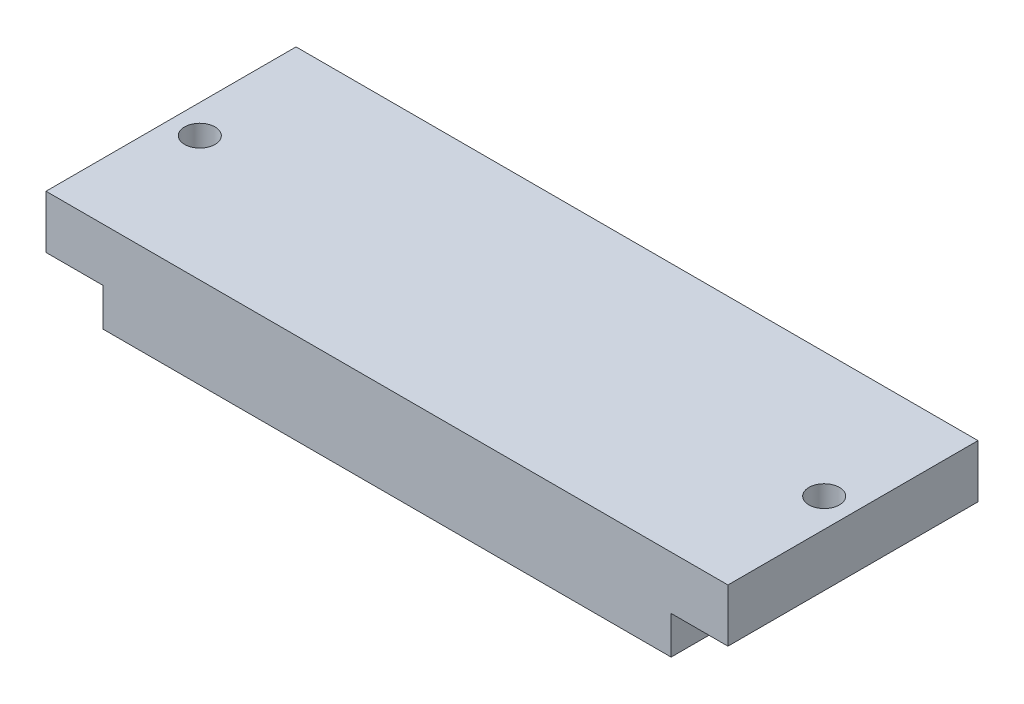
ISO-10303-21;
HEADER;
FILE_DESCRIPTION(('STEP AP214'),'2;1');
FILE_NAME('part.step','',(''),(''),'','','');
FILE_SCHEMA(('AUTOMOTIVE_DESIGN { 1 0 10303 214 1 1 1 1 }'));
ENDSEC;
DATA;
#1=APPLICATION_CONTEXT('core data for automotive mechanical design processes');
#2=APPLICATION_PROTOCOL_DEFINITION('international standard','automotive_design',2000,#1);
#3=PRODUCT_CONTEXT('',#1,'mechanical');
#4=PRODUCT('Part','Part','',(#3));
#5=PRODUCT_RELATED_PRODUCT_CATEGORY('part','',(#4));
#6=PRODUCT_DEFINITION_FORMATION('','',#4);
#7=PRODUCT_DEFINITION_CONTEXT('part definition',#1,'design');
#8=PRODUCT_DEFINITION('design','',#6,#7);
#9=PRODUCT_DEFINITION_SHAPE('','',#8);
#10=(LENGTH_UNIT() NAMED_UNIT(*) SI_UNIT(.MILLI.,.METRE.));
#11=(NAMED_UNIT(*) PLANE_ANGLE_UNIT() SI_UNIT($,.RADIAN.));
#12=(NAMED_UNIT(*) SI_UNIT($,.STERADIAN.) SOLID_ANGLE_UNIT());
#13=UNCERTAINTY_MEASURE_WITH_UNIT(LENGTH_MEASURE(1.E-05),#10,'distance_accuracy_value','');
#14=(GEOMETRIC_REPRESENTATION_CONTEXT(3) GLOBAL_UNCERTAINTY_ASSIGNED_CONTEXT((#13)) GLOBAL_UNIT_ASSIGNED_CONTEXT((#10,
#11,#12)) REPRESENTATION_CONTEXT('',''));
#15=CARTESIAN_POINT('',(0.,0.,0.));
#16=DIRECTION('',(0.,0.,1.));
#17=DIRECTION('',(1.,0.,0.));
#18=AXIS2_PLACEMENT_3D('',#15,#16,#17);
#19=CARTESIAN_POINT('',(0.,0.,41.91));
#20=DIRECTION('',(1.,0.,0.));
#21=DIRECTION('',(0.,1.,0.));
#22=AXIS2_PLACEMENT_3D('',#19,#20,#21);
#23=PLANE('',#22);
#24=DIRECTION('',(0.,-1.,0.));
#25=VECTOR('',#24,1.);
#26=CARTESIAN_POINT('',(0.,0.,0.));
#27=LINE('',#26,#25);
#28=CARTESIAN_POINT('',(0.,0.,0.));
#29=VERTEX_POINT('',#28);
#30=CARTESIAN_POINT('',(0.,-8.89,0.));
#31=VERTEX_POINT('',#30);
#32=EDGE_CURVE('E128',#29,#31,#27,.T.);
#33=ORIENTED_EDGE('',*,*,#32,.T.);
#34=DIRECTION('',(0.,0.,-1.));
#35=VECTOR('',#34,1.);
#36=CARTESIAN_POINT('',(0.,-8.89,41.91));
#37=LINE('',#36,#35);
#38=CARTESIAN_POINT('',(0.,-8.89,41.91));
#39=VERTEX_POINT('',#38);
#40=EDGE_CURVE('E11',#39,#31,#37,.T.);
#41=ORIENTED_EDGE('',*,*,#40,.F.);
#42=DIRECTION('',(0.,-1.,0.));
#43=VECTOR('',#42,1.);
#44=CARTESIAN_POINT('',(0.,0.,41.91));
#45=LINE('',#44,#43);
#46=CARTESIAN_POINT('',(0.,0.,41.91));
#47=VERTEX_POINT('',#46);
#48=EDGE_CURVE('E143',#47,#39,#45,.T.);
#49=ORIENTED_EDGE('',*,*,#48,.F.);
#50=DIRECTION('',(0.,0.,-1.));
#51=VECTOR('',#50,1.);
#52=CARTESIAN_POINT('',(0.,0.,41.91));
#53=LINE('',#52,#51);
#54=EDGE_CURVE('E124',#47,#29,#53,.T.);
#55=ORIENTED_EDGE('',*,*,#54,.T.);
#56=EDGE_LOOP('',(#33,#41,#49,#55));
#57=FACE_BOUND('',#56,.T.);
#58=ADVANCED_FACE('F32',(#57),#23,.F.);
#59=CARTESIAN_POINT('',(0.,-8.89,41.91));
#60=DIRECTION('',(0.,1.,0.));
#61=DIRECTION('',(0.,0.,1.));
#62=AXIS2_PLACEMENT_3D('',#59,#60,#61);
#63=PLANE('',#62);
#64=CARTESIAN_POINT('',(4.826,-8.89,20.955));
#65=DIRECTION('',(0.,1.,0.));
#66=DIRECTION('',(0.,0.,1.));
#67=AXIS2_PLACEMENT_3D('',#64,#65,#66);
#68=CIRCLE('',#67,2.55269999999999);
#69=CARTESIAN_POINT('',(4.826,-8.89,23.5077));
#70=VERTEX_POINT('',#69);
#71=EDGE_CURVE('E181',#70,#70,#68,.T.);
#72=ORIENTED_EDGE('',*,*,#71,.T.);
#73=EDGE_LOOP('',(#72));
#74=FACE_BOUND('',#73,.T.);
#75=DIRECTION('',(1.,0.,0.));
#76=VECTOR('',#75,1.);
#77=CARTESIAN_POINT('',(0.,-8.89,0.));
#78=LINE('',#77,#76);
#79=CARTESIAN_POINT('',(9.525,-8.89,0.));
#80=VERTEX_POINT('',#79);
#81=EDGE_CURVE('E131',#31,#80,#78,.T.);
#82=ORIENTED_EDGE('',*,*,#81,.T.);
#83=DIRECTION('',(0.,0.,-1.));
#84=VECTOR('',#83,1.);
#85=CARTESIAN_POINT('',(9.525,-8.89,41.91));
#86=LINE('',#85,#84);
#87=CARTESIAN_POINT('',(9.525,-8.89,41.91));
#88=VERTEX_POINT('',#87);
#89=EDGE_CURVE('E40',#88,#80,#86,.T.);
#90=ORIENTED_EDGE('',*,*,#89,.F.);
#91=DIRECTION('',(1.,0.,0.));
#92=VECTOR('',#91,1.);
#93=CARTESIAN_POINT('',(0.,-8.89,41.91));
#94=LINE('',#93,#92);
#95=EDGE_CURVE('E91',#39,#88,#94,.T.);
#96=ORIENTED_EDGE('',*,*,#95,.F.);
#97=ORIENTED_EDGE('',*,*,#40,.T.);
#98=EDGE_LOOP('',(#82,#90,#96,#97));
#99=FACE_BOUND('',#98,.T.);
#100=ADVANCED_FACE('F212',(#74,#99),#63,.F.);
#101=CARTESIAN_POINT('',(9.525,-8.89,41.91));
#102=DIRECTION('',(1.,0.,0.));
#103=DIRECTION('',(0.,0.,-1.));
#104=AXIS2_PLACEMENT_3D('',#101,#102,#103);
#105=PLANE('',#104);
#106=DIRECTION('',(0.,-1.,0.));
#107=VECTOR('',#106,1.);
#108=CARTESIAN_POINT('',(9.525,-8.89,0.));
#109=LINE('',#108,#107);
#110=CARTESIAN_POINT('',(9.525,-15.24,0.));
#111=VERTEX_POINT('',#110);
#112=EDGE_CURVE('E134',#80,#111,#109,.T.);
#113=ORIENTED_EDGE('',*,*,#112,.T.);
#114=DIRECTION('',(0.,0.,-1.));
#115=VECTOR('',#114,1.);
#116=CARTESIAN_POINT('',(9.525,-15.24,41.91));
#117=LINE('',#116,#115);
#118=CARTESIAN_POINT('',(9.525,-15.24,41.91));
#119=VERTEX_POINT('',#118);
#120=EDGE_CURVE('E150',#119,#111,#117,.T.);
#121=ORIENTED_EDGE('',*,*,#120,.F.);
#122=DIRECTION('',(0.,-1.,0.));
#123=VECTOR('',#122,1.);
#124=CARTESIAN_POINT('',(9.525,-8.89,41.91));
#125=LINE('',#124,#123);
#126=EDGE_CURVE('E158',#88,#119,#125,.T.);
#127=ORIENTED_EDGE('',*,*,#126,.F.);
#128=ORIENTED_EDGE('',*,*,#89,.T.);
#129=EDGE_LOOP('',(#113,#121,#127,#128));
#130=FACE_BOUND('',#129,.T.);
#131=ADVANCED_FACE('F156',(#130),#105,.F.);
#132=CARTESIAN_POINT('',(9.525,-15.24,41.91));
#133=DIRECTION('',(0.,1.,0.));
#134=DIRECTION('',(0.,0.,1.));
#135=AXIS2_PLACEMENT_3D('',#132,#133,#134);
#136=PLANE('',#135);
#137=DIRECTION('',(1.,0.,0.));
#138=VECTOR('',#137,1.);
#139=CARTESIAN_POINT('',(9.525,-15.24,0.));
#140=LINE('',#139,#138);
#141=CARTESIAN_POINT('',(104.775,-15.24,0.));
#142=VERTEX_POINT('',#141);
#143=EDGE_CURVE('E136',#111,#142,#140,.T.);
#144=ORIENTED_EDGE('',*,*,#143,.T.);
#145=DIRECTION('',(0.,0.,-1.));
#146=VECTOR('',#145,1.);
#147=CARTESIAN_POINT('',(104.775,-15.24,41.91));
#148=LINE('',#147,#146);
#149=CARTESIAN_POINT('',(104.775,-15.24,41.91));
#150=VERTEX_POINT('',#149);
#151=EDGE_CURVE('E147',#150,#142,#148,.T.);
#152=ORIENTED_EDGE('',*,*,#151,.F.);
#153=DIRECTION('',(1.,0.,0.));
#154=VECTOR('',#153,1.);
#155=CARTESIAN_POINT('',(9.525,-15.24,41.91));
#156=LINE('',#155,#154);
#157=EDGE_CURVE('E170',#119,#150,#156,.T.);
#158=ORIENTED_EDGE('',*,*,#157,.F.);
#159=ORIENTED_EDGE('',*,*,#120,.T.);
#160=EDGE_LOOP('',(#144,#152,#158,#159));
#161=FACE_BOUND('',#160,.T.);
#162=ADVANCED_FACE('F166',(#161),#136,.F.);
#163=CARTESIAN_POINT('',(104.775,-8.89,41.91));
#164=DIRECTION('',(-1.,0.,0.));
#165=DIRECTION('',(0.,0.,1.));
#166=AXIS2_PLACEMENT_3D('',#163,#164,#165);
#167=PLANE('',#166);
#168=DIRECTION('',(0.,1.,0.));
#169=VECTOR('',#168,1.);
#170=CARTESIAN_POINT('',(104.775,-8.89,0.));
#171=LINE('',#170,#169);
#172=CARTESIAN_POINT('',(104.775,-8.89,0.));
#173=VERTEX_POINT('',#172);
#174=EDGE_CURVE('E138',#142,#173,#171,.T.);
#175=ORIENTED_EDGE('',*,*,#174,.T.);
#176=DIRECTION('',(0.,0.,-1.));
#177=VECTOR('',#176,1.);
#178=CARTESIAN_POINT('',(104.775,-8.89,41.91));
#179=LINE('',#178,#177);
#180=CARTESIAN_POINT('',(104.775,-8.89,41.91));
#181=VERTEX_POINT('',#180);
#182=EDGE_CURVE('E119',#181,#173,#179,.T.);
#183=ORIENTED_EDGE('',*,*,#182,.F.);
#184=DIRECTION('',(0.,1.,0.));
#185=VECTOR('',#184,1.);
#186=CARTESIAN_POINT('',(104.775,-8.89,41.91));
#187=LINE('',#186,#185);
#188=EDGE_CURVE('E110',#150,#181,#187,.T.);
#189=ORIENTED_EDGE('',*,*,#188,.F.);
#190=ORIENTED_EDGE('',*,*,#151,.T.);
#191=EDGE_LOOP('',(#175,#183,#189,#190));
#192=FACE_BOUND('',#191,.T.);
#193=ADVANCED_FACE('F169',(#192),#167,.F.);
#194=CARTESIAN_POINT('',(114.3,-8.89,41.91));
#195=DIRECTION('',(0.,1.,0.));
#196=DIRECTION('',(-1.,0.,0.));
#197=AXIS2_PLACEMENT_3D('',#194,#195,#196);
#198=PLANE('',#197);
#199=CARTESIAN_POINT('',(109.474,-8.89,20.955));
#200=DIRECTION('',(0.,1.,0.));
#201=DIRECTION('',(-1.,0.,0.));
#202=AXIS2_PLACEMENT_3D('',#199,#200,#201);
#203=CIRCLE('',#202,2.55269999999999);
#204=CARTESIAN_POINT('',(106.9213,-8.89,20.955));
#205=VERTEX_POINT('',#204);
#206=EDGE_CURVE('E132',#205,#205,#203,.T.);
#207=ORIENTED_EDGE('',*,*,#206,.T.);
#208=EDGE_LOOP('',(#207));
#209=FACE_BOUND('',#208,.T.);
#210=DIRECTION('',(1.,0.,0.));
#211=VECTOR('',#210,1.);
#212=CARTESIAN_POINT('',(114.3,-8.89,0.));
#213=LINE('',#212,#211);
#214=CARTESIAN_POINT('',(114.3,-8.89,0.));
#215=VERTEX_POINT('',#214);
#216=EDGE_CURVE('E118',#173,#215,#213,.T.);
#217=ORIENTED_EDGE('',*,*,#216,.T.);
#218=DIRECTION('',(0.,0.,-1.));
#219=VECTOR('',#218,1.);
#220=CARTESIAN_POINT('',(114.3,-8.89,41.91));
#221=LINE('',#220,#219);
#222=CARTESIAN_POINT('',(114.3,-8.89,41.91));
#223=VERTEX_POINT('',#222);
#224=EDGE_CURVE('E115',#223,#215,#221,.T.);
#225=ORIENTED_EDGE('',*,*,#224,.F.);
#226=DIRECTION('',(1.,0.,0.));
#227=VECTOR('',#226,1.);
#228=CARTESIAN_POINT('',(114.3,-8.89,41.91));
#229=LINE('',#228,#227);
#230=EDGE_CURVE('E104',#181,#223,#229,.T.);
#231=ORIENTED_EDGE('',*,*,#230,.F.);
#232=ORIENTED_EDGE('',*,*,#182,.T.);
#233=EDGE_LOOP('',(#217,#225,#231,#232));
#234=FACE_BOUND('',#233,.T.);
#235=ADVANCED_FACE('F116',(#209,#234),#198,.F.);
#236=CARTESIAN_POINT('',(114.3,0.,41.91));
#237=DIRECTION('',(-1.,0.,0.));
#238=DIRECTION('',(0.,0.,1.));
#239=AXIS2_PLACEMENT_3D('',#236,#237,#238);
#240=PLANE('',#239);
#241=DIRECTION('',(0.,1.,0.));
#242=VECTOR('',#241,1.);
#243=CARTESIAN_POINT('',(114.3,0.,0.));
#244=LINE('',#243,#242);
#245=CARTESIAN_POINT('',(114.3,0.,0.));
#246=VERTEX_POINT('',#245);
#247=EDGE_CURVE('E77',#215,#246,#244,.T.);
#248=ORIENTED_EDGE('',*,*,#247,.T.);
#249=DIRECTION('',(0.,0.,-1.));
#250=VECTOR('',#249,1.);
#251=CARTESIAN_POINT('',(114.3,0.,41.91));
#252=LINE('',#251,#250);
#253=CARTESIAN_POINT('',(114.3,0.,41.91));
#254=VERTEX_POINT('',#253);
#255=EDGE_CURVE('E120',#254,#246,#252,.T.);
#256=ORIENTED_EDGE('',*,*,#255,.F.);
#257=DIRECTION('',(0.,1.,0.));
#258=VECTOR('',#257,1.);
#259=CARTESIAN_POINT('',(114.3,0.,41.91));
#260=LINE('',#259,#258);
#261=EDGE_CURVE('E108',#223,#254,#260,.T.);
#262=ORIENTED_EDGE('',*,*,#261,.F.);
#263=ORIENTED_EDGE('',*,*,#224,.T.);
#264=EDGE_LOOP('',(#248,#256,#262,#263));
#265=FACE_BOUND('',#264,.T.);
#266=ADVANCED_FACE('F122',(#265),#240,.F.);
#267=CARTESIAN_POINT('',(0.,0.,41.91));
#268=DIRECTION('',(0.,-1.,0.));
#269=DIRECTION('',(0.,0.,-1.));
#270=AXIS2_PLACEMENT_3D('',#267,#268,#269);
#271=PLANE('',#270);
#272=CARTESIAN_POINT('',(4.826,0.,20.955));
#273=DIRECTION('',(0.,1.,0.));
#274=DIRECTION('',(0.,0.,1.));
#275=AXIS2_PLACEMENT_3D('',#272,#273,#274);
#276=CIRCLE('',#275,2.55269999999999);
#277=CARTESIAN_POINT('',(4.826,0.,23.5077));
#278=VERTEX_POINT('',#277);
#279=EDGE_CURVE('E184',#278,#278,#276,.T.);
#280=ORIENTED_EDGE('',*,*,#279,.F.);
#281=EDGE_LOOP('',(#280));
#282=FACE_BOUND('',#281,.T.);
#283=CARTESIAN_POINT('',(109.474,0.,20.955));
#284=DIRECTION('',(0.,1.,0.));
#285=DIRECTION('',(0.,0.,1.));
#286=AXIS2_PLACEMENT_3D('',#283,#284,#285);
#287=CIRCLE('',#286,2.55269999999999);
#288=CARTESIAN_POINT('',(109.474,0.,23.5077));
#289=VERTEX_POINT('',#288);
#290=EDGE_CURVE('E178',#289,#289,#287,.T.);
#291=ORIENTED_EDGE('',*,*,#290,.F.);
#292=EDGE_LOOP('',(#291));
#293=FACE_BOUND('',#292,.T.);
#294=DIRECTION('',(-1.,0.,0.));
#295=VECTOR('',#294,1.);
#296=CARTESIAN_POINT('',(0.,0.,0.));
#297=LINE('',#296,#295);
#298=EDGE_CURVE('E83',#246,#29,#297,.T.);
#299=ORIENTED_EDGE('',*,*,#298,.T.);
#300=ORIENTED_EDGE('',*,*,#54,.F.);
#301=DIRECTION('',(-1.,0.,0.));
#302=VECTOR('',#301,1.);
#303=CARTESIAN_POINT('',(0.,0.,41.91));
#304=LINE('',#303,#302);
#305=EDGE_CURVE('E48',#254,#47,#304,.T.);
#306=ORIENTED_EDGE('',*,*,#305,.F.);
#307=ORIENTED_EDGE('',*,*,#255,.T.);
#308=EDGE_LOOP('',(#299,#300,#306,#307));
#309=FACE_BOUND('',#308,.T.);
#310=ADVANCED_FACE('F191',(#282,#293,#309),#271,.F.);
#311=CARTESIAN_POINT('',(0.,-8.89,41.91));
#312=DIRECTION('',(0.,0.,1.));
#313=DIRECTION('',(1.,0.,0.));
#314=AXIS2_PLACEMENT_3D('',#311,#312,#313);
#315=PLANE('',#314);
#316=ORIENTED_EDGE('',*,*,#48,.T.);
#317=ORIENTED_EDGE('',*,*,#95,.T.);
#318=ORIENTED_EDGE('',*,*,#126,.T.);
#319=ORIENTED_EDGE('',*,*,#157,.T.);
#320=ORIENTED_EDGE('',*,*,#188,.T.);
#321=ORIENTED_EDGE('',*,*,#230,.T.);
#322=ORIENTED_EDGE('',*,*,#261,.T.);
#323=ORIENTED_EDGE('',*,*,#305,.T.);
#324=EDGE_LOOP('',(#316,#317,#318,#319,#320,#321,#322,#323));
#325=FACE_BOUND('',#324,.T.);
#326=ADVANCED_FACE('F106',(#325),#315,.T.);
#327=CARTESIAN_POINT('',(0.,-8.89,0.));
#328=DIRECTION('',(0.,0.,1.));
#329=DIRECTION('',(1.,0.,0.));
#330=AXIS2_PLACEMENT_3D('',#327,#328,#329);
#331=PLANE('',#330);
#332=ORIENTED_EDGE('',*,*,#32,.F.);
#333=ORIENTED_EDGE('',*,*,#298,.F.);
#334=ORIENTED_EDGE('',*,*,#247,.F.);
#335=ORIENTED_EDGE('',*,*,#216,.F.);
#336=ORIENTED_EDGE('',*,*,#174,.F.);
#337=ORIENTED_EDGE('',*,*,#143,.F.);
#338=ORIENTED_EDGE('',*,*,#112,.F.);
#339=ORIENTED_EDGE('',*,*,#81,.F.);
#340=EDGE_LOOP('',(#332,#333,#334,#335,#336,#337,#338,#339));
#341=FACE_BOUND('',#340,.T.);
#342=ADVANCED_FACE('F162',(#341),#331,.F.);
#343=CARTESIAN_POINT('',(109.474,0.,20.955));
#344=DIRECTION('',(0.,1.,0.));
#345=DIRECTION('',(0.,0.,1.));
#346=AXIS2_PLACEMENT_3D('',#343,#344,#345);
#347=CYLINDRICAL_SURFACE('',#346,2.55269999999999);
#348=ORIENTED_EDGE('',*,*,#290,.T.);
#349=EDGE_LOOP('',(#348));
#350=FACE_BOUND('',#349,.T.);
#351=ORIENTED_EDGE('',*,*,#206,.F.);
#352=EDGE_LOOP('',(#351));
#353=FACE_BOUND('',#352,.T.);
#354=ADVANCED_FACE('F197',(#350,#353),#347,.F.);
#355=CARTESIAN_POINT('',(4.826,0.,20.955));
#356=DIRECTION('',(0.,1.,0.));
#357=DIRECTION('',(0.,0.,1.));
#358=AXIS2_PLACEMENT_3D('',#355,#356,#357);
#359=CYLINDRICAL_SURFACE('',#358,2.55269999999999);
#360=ORIENTED_EDGE('',*,*,#279,.T.);
#361=EDGE_LOOP('',(#360));
#362=FACE_BOUND('',#361,.T.);
#363=ORIENTED_EDGE('',*,*,#71,.F.);
#364=EDGE_LOOP('',(#363));
#365=FACE_BOUND('',#364,.T.);
#366=ADVANCED_FACE('F188',(#362,#365),#359,.F.);
#367=CLOSED_SHELL('',(#58,#100,#131,#162,#193,#235,#266,#310,#326,#342,#354,#366));
#368=MANIFOLD_SOLID_BREP('B2',#367);
#369=ADVANCED_BREP_SHAPE_REPRESENTATION('',(#18,#368),#14);
#370=SHAPE_DEFINITION_REPRESENTATION(#9,#369);
ENDSEC;
END-ISO-10303-21;
